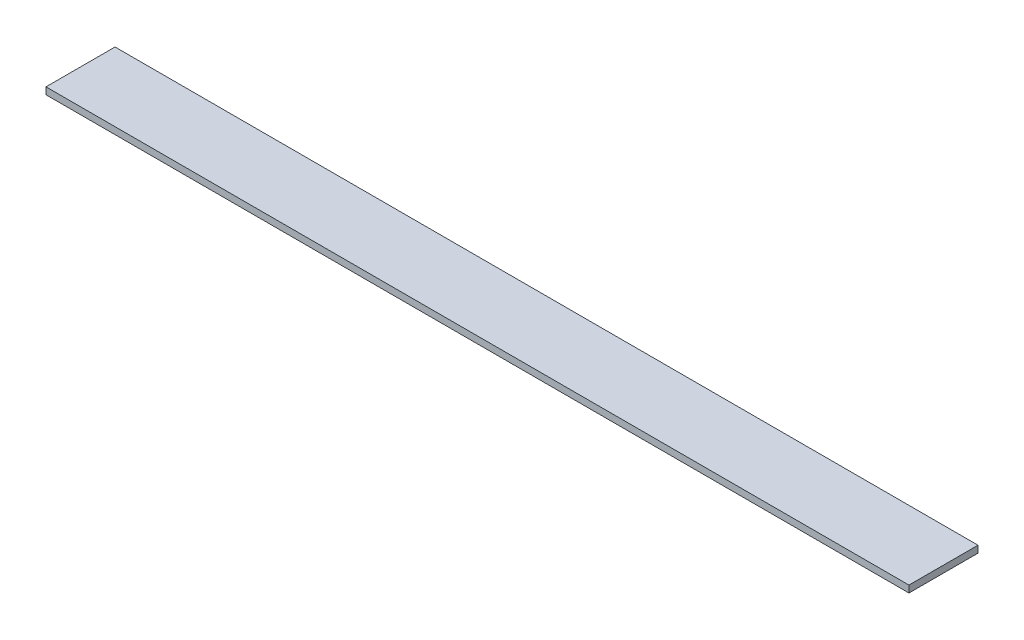
ISO-10303-21;
HEADER;
FILE_DESCRIPTION(('STEP AP214'),'2;1');
FILE_NAME('part.step','',(''),(''),'','','');
FILE_SCHEMA(('AUTOMOTIVE_DESIGN { 1 0 10303 214 1 1 1 1 }'));
ENDSEC;
DATA;
#1=APPLICATION_CONTEXT('core data for automotive mechanical design processes');
#2=APPLICATION_PROTOCOL_DEFINITION('international standard','automotive_design',2000,#1);
#3=PRODUCT_CONTEXT('',#1,'mechanical');
#4=PRODUCT('Part','Part','',(#3));
#5=PRODUCT_RELATED_PRODUCT_CATEGORY('part','',(#4));
#6=PRODUCT_DEFINITION_FORMATION('','',#4);
#7=PRODUCT_DEFINITION_CONTEXT('part definition',#1,'design');
#8=PRODUCT_DEFINITION('design','',#6,#7);
#9=PRODUCT_DEFINITION_SHAPE('','',#8);
#10=(LENGTH_UNIT() NAMED_UNIT(*) SI_UNIT(.MILLI.,.METRE.));
#11=(NAMED_UNIT(*) PLANE_ANGLE_UNIT() SI_UNIT($,.RADIAN.));
#12=(NAMED_UNIT(*) SI_UNIT($,.STERADIAN.) SOLID_ANGLE_UNIT());
#13=UNCERTAINTY_MEASURE_WITH_UNIT(LENGTH_MEASURE(1.E-05),#10,'distance_accuracy_value','');
#14=(GEOMETRIC_REPRESENTATION_CONTEXT(3) GLOBAL_UNCERTAINTY_ASSIGNED_CONTEXT((#13)) GLOBAL_UNIT_ASSIGNED_CONTEXT((#10,
#11,#12)) REPRESENTATION_CONTEXT('',''));
#15=CARTESIAN_POINT('',(0.,0.,0.));
#16=DIRECTION('',(0.,0.,1.));
#17=DIRECTION('',(1.,0.,0.));
#18=AXIS2_PLACEMENT_3D('',#15,#16,#17);
#19=CARTESIAN_POINT('',(0.,4.,0.));
#20=DIRECTION('',(1.,0.,0.));
#21=DIRECTION('',(0.,0.,-1.));
#22=AXIS2_PLACEMENT_3D('',#19,#20,#21);
#23=PLANE('',#22);
#24=DIRECTION('',(0.,0.,1.));
#25=VECTOR('',#24,1.);
#26=CARTESIAN_POINT('',(0.,0.,0.));
#27=LINE('',#26,#25);
#28=CARTESIAN_POINT('',(0.,0.,-40.));
#29=VERTEX_POINT('',#28);
#30=CARTESIAN_POINT('',(0.,0.,0.));
#31=VERTEX_POINT('',#30);
#32=EDGE_CURVE('E107',#29,#31,#27,.T.);
#33=ORIENTED_EDGE('',*,*,#32,.T.);
#34=DIRECTION('',(0.,-1.,0.));
#35=VECTOR('',#34,1.);
#36=CARTESIAN_POINT('',(0.,4.,0.));
#37=LINE('',#36,#35);
#38=CARTESIAN_POINT('',(0.,4.,0.));
#39=VERTEX_POINT('',#38);
#40=EDGE_CURVE('E11',#39,#31,#37,.T.);
#41=ORIENTED_EDGE('',*,*,#40,.F.);
#42=DIRECTION('',(0.,0.,1.));
#43=VECTOR('',#42,1.);
#44=CARTESIAN_POINT('',(0.,4.,0.));
#45=LINE('',#44,#43);
#46=CARTESIAN_POINT('',(0.,4.,-40.));
#47=VERTEX_POINT('',#46);
#48=EDGE_CURVE('E91',#47,#39,#45,.T.);
#49=ORIENTED_EDGE('',*,*,#48,.F.);
#50=DIRECTION('',(0.,-1.,0.));
#51=VECTOR('',#50,1.);
#52=CARTESIAN_POINT('',(0.,4.,-40.));
#53=LINE('',#52,#51);
#54=EDGE_CURVE('E103',#47,#29,#53,.T.);
#55=ORIENTED_EDGE('',*,*,#54,.T.);
#56=EDGE_LOOP('',(#33,#41,#49,#55));
#57=FACE_BOUND('',#56,.T.);
#58=ADVANCED_FACE('F39',(#57),#23,.F.);
#59=CARTESIAN_POINT('',(0.,4.,0.));
#60=DIRECTION('',(0.,0.,-1.));
#61=DIRECTION('',(-1.,0.,0.));
#62=AXIS2_PLACEMENT_3D('',#59,#60,#61);
#63=PLANE('',#62);
#64=DIRECTION('',(1.,0.,0.));
#65=VECTOR('',#64,1.);
#66=CARTESIAN_POINT('',(0.,0.,0.));
#67=LINE('',#66,#65);
#68=CARTESIAN_POINT('',(500.,0.,0.));
#69=VERTEX_POINT('',#68);
#70=EDGE_CURVE('E96',#31,#69,#67,.T.);
#71=ORIENTED_EDGE('',*,*,#70,.T.);
#72=DIRECTION('',(0.,-1.,0.));
#73=VECTOR('',#72,1.);
#74=CARTESIAN_POINT('',(500.,4.,0.));
#75=LINE('',#74,#73);
#76=CARTESIAN_POINT('',(500.,4.,0.));
#77=VERTEX_POINT('',#76);
#78=EDGE_CURVE('E48',#77,#69,#75,.T.);
#79=ORIENTED_EDGE('',*,*,#78,.F.);
#80=DIRECTION('',(1.,0.,0.));
#81=VECTOR('',#80,1.);
#82=CARTESIAN_POINT('',(0.,4.,0.));
#83=LINE('',#82,#81);
#84=EDGE_CURVE('E86',#39,#77,#83,.T.);
#85=ORIENTED_EDGE('',*,*,#84,.F.);
#86=ORIENTED_EDGE('',*,*,#40,.T.);
#87=EDGE_LOOP('',(#71,#79,#85,#86));
#88=FACE_BOUND('',#87,.T.);
#89=ADVANCED_FACE('F95',(#88),#63,.F.);
#90=CARTESIAN_POINT('',(500.,4.,0.));
#91=DIRECTION('',(-1.,0.,0.));
#92=DIRECTION('',(0.,0.,1.));
#93=AXIS2_PLACEMENT_3D('',#90,#91,#92);
#94=PLANE('',#93);
#95=DIRECTION('',(0.,0.,-1.));
#96=VECTOR('',#95,1.);
#97=CARTESIAN_POINT('',(500.,0.,0.));
#98=LINE('',#97,#96);
#99=CARTESIAN_POINT('',(500.,0.,-40.));
#100=VERTEX_POINT('',#99);
#101=EDGE_CURVE('E73',#69,#100,#98,.T.);
#102=ORIENTED_EDGE('',*,*,#101,.T.);
#103=DIRECTION('',(0.,-1.,0.));
#104=VECTOR('',#103,1.);
#105=CARTESIAN_POINT('',(500.,4.,-40.));
#106=LINE('',#105,#104);
#107=CARTESIAN_POINT('',(500.,4.,-40.));
#108=VERTEX_POINT('',#107);
#109=EDGE_CURVE('E98',#108,#100,#106,.T.);
#110=ORIENTED_EDGE('',*,*,#109,.F.);
#111=DIRECTION('',(0.,0.,-1.));
#112=VECTOR('',#111,1.);
#113=CARTESIAN_POINT('',(500.,4.,0.));
#114=LINE('',#113,#112);
#115=EDGE_CURVE('E89',#77,#108,#114,.T.);
#116=ORIENTED_EDGE('',*,*,#115,.F.);
#117=ORIENTED_EDGE('',*,*,#78,.T.);
#118=EDGE_LOOP('',(#102,#110,#116,#117));
#119=FACE_BOUND('',#118,.T.);
#120=ADVANCED_FACE('F99',(#119),#94,.F.);
#121=CARTESIAN_POINT('',(0.,4.,-40.));
#122=DIRECTION('',(0.,0.,1.));
#123=DIRECTION('',(1.,0.,0.));
#124=AXIS2_PLACEMENT_3D('',#121,#122,#123);
#125=PLANE('',#124);
#126=DIRECTION('',(-1.,0.,0.));
#127=VECTOR('',#126,1.);
#128=CARTESIAN_POINT('',(0.,0.,-40.));
#129=LINE('',#128,#127);
#130=EDGE_CURVE('E79',#100,#29,#129,.T.);
#131=ORIENTED_EDGE('',*,*,#130,.T.);
#132=ORIENTED_EDGE('',*,*,#54,.F.);
#133=DIRECTION('',(-1.,0.,0.));
#134=VECTOR('',#133,1.);
#135=CARTESIAN_POINT('',(0.,4.,-40.));
#136=LINE('',#135,#134);
#137=EDGE_CURVE('E56',#108,#47,#136,.T.);
#138=ORIENTED_EDGE('',*,*,#137,.F.);
#139=ORIENTED_EDGE('',*,*,#109,.T.);
#140=EDGE_LOOP('',(#131,#132,#138,#139));
#141=FACE_BOUND('',#140,.T.);
#142=ADVANCED_FACE('F120',(#141),#125,.F.);
#143=CARTESIAN_POINT('',(0.,4.,0.));
#144=DIRECTION('',(0.,-1.,0.));
#145=DIRECTION('',(0.,0.,-1.));
#146=AXIS2_PLACEMENT_3D('',#143,#144,#145);
#147=PLANE('',#146);
#148=ORIENTED_EDGE('',*,*,#48,.T.);
#149=ORIENTED_EDGE('',*,*,#84,.T.);
#150=ORIENTED_EDGE('',*,*,#115,.T.);
#151=ORIENTED_EDGE('',*,*,#137,.T.);
#152=EDGE_LOOP('',(#148,#149,#150,#151));
#153=FACE_BOUND('',#152,.T.);
#154=ADVANCED_FACE('F87',(#153),#147,.F.);
#155=CARTESIAN_POINT('',(0.,0.,0.));
#156=DIRECTION('',(0.,-1.,0.));
#157=DIRECTION('',(0.,0.,-1.));
#158=AXIS2_PLACEMENT_3D('',#155,#156,#157);
#159=PLANE('',#158);
#160=ORIENTED_EDGE('',*,*,#32,.F.);
#161=ORIENTED_EDGE('',*,*,#130,.F.);
#162=ORIENTED_EDGE('',*,*,#101,.F.);
#163=ORIENTED_EDGE('',*,*,#70,.F.);
#164=EDGE_LOOP('',(#160,#161,#162,#163));
#165=FACE_BOUND('',#164,.T.);
#166=ADVANCED_FACE('F123',(#165),#159,.T.);
#167=CLOSED_SHELL('',(#58,#89,#120,#142,#154,#166));
#168=MANIFOLD_SOLID_BREP('B2',#167);
#169=ADVANCED_BREP_SHAPE_REPRESENTATION('',(#18,#168),#14);
#170=SHAPE_DEFINITION_REPRESENTATION(#9,#169);
ENDSEC;
END-ISO-10303-21;
